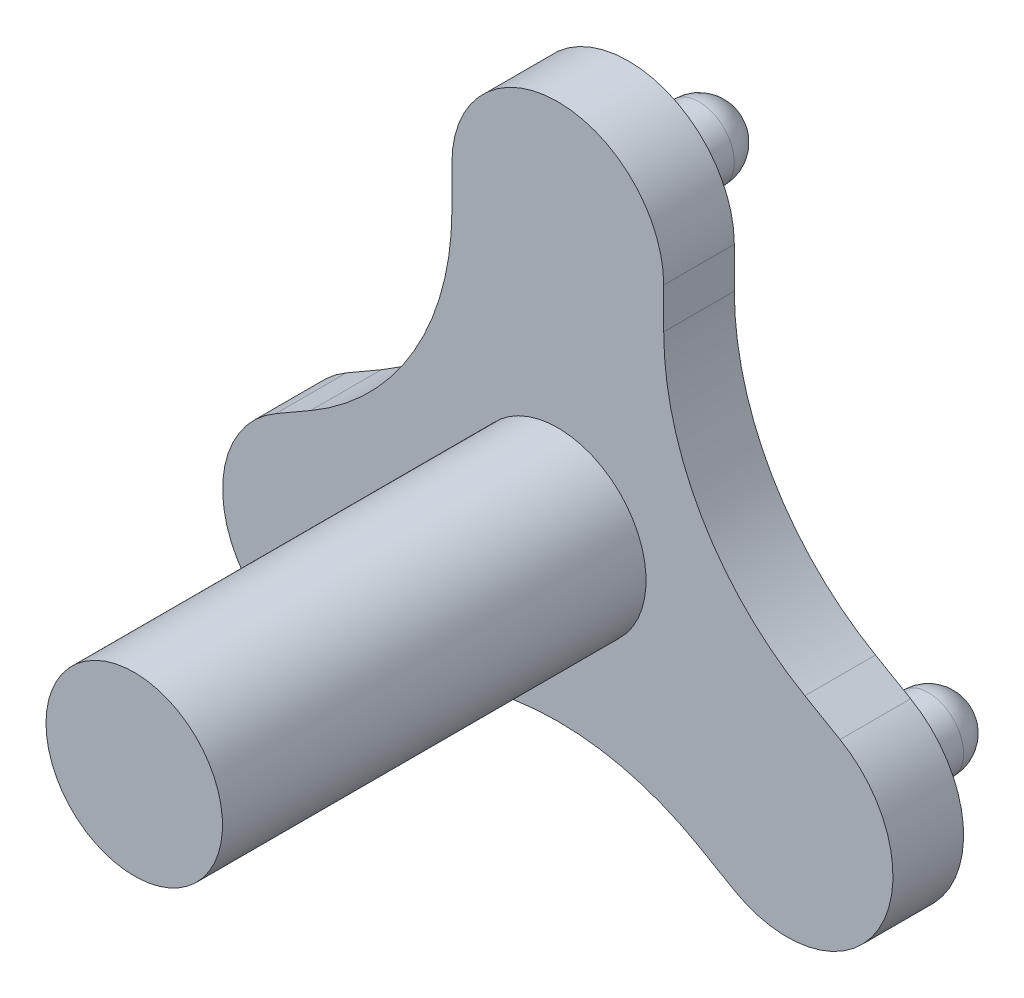
ISO-10303-21;
HEADER;
FILE_DESCRIPTION(('STEP AP214'),'2;1');
FILE_NAME('part.step','',(''),(''),'','','');
FILE_SCHEMA(('AUTOMOTIVE_DESIGN { 1 0 10303 214 1 1 1 1 }'));
ENDSEC;
DATA;
#1=APPLICATION_CONTEXT('core data for automotive mechanical design processes');
#2=APPLICATION_PROTOCOL_DEFINITION('international standard','automotive_design',2000,#1);
#3=PRODUCT_CONTEXT('',#1,'mechanical');
#4=PRODUCT('Part','Part','',(#3));
#5=PRODUCT_RELATED_PRODUCT_CATEGORY('part','',(#4));
#6=PRODUCT_DEFINITION_FORMATION('','',#4);
#7=PRODUCT_DEFINITION_CONTEXT('part definition',#1,'design');
#8=PRODUCT_DEFINITION('design','',#6,#7);
#9=PRODUCT_DEFINITION_SHAPE('','',#8);
#10=(LENGTH_UNIT() NAMED_UNIT(*) SI_UNIT(.MILLI.,.METRE.));
#11=(NAMED_UNIT(*) PLANE_ANGLE_UNIT() SI_UNIT($,.RADIAN.));
#12=(NAMED_UNIT(*) SI_UNIT($,.STERADIAN.) SOLID_ANGLE_UNIT());
#13=UNCERTAINTY_MEASURE_WITH_UNIT(LENGTH_MEASURE(1.E-05),#10,'distance_accuracy_value','');
#14=(GEOMETRIC_REPRESENTATION_CONTEXT(3) GLOBAL_UNCERTAINTY_ASSIGNED_CONTEXT((#13)) GLOBAL_UNIT_ASSIGNED_CONTEXT((#10,
#11,#12)) REPRESENTATION_CONTEXT('',''));
#15=CARTESIAN_POINT('',(0.,0.,0.));
#16=DIRECTION('',(0.,0.,1.));
#17=DIRECTION('',(1.,0.,0.));
#18=AXIS2_PLACEMENT_3D('',#15,#16,#17);
#19=CARTESIAN_POINT('',(4.7625,-8.24889197104678,6.35));
#20=DIRECTION('',(0.5,-0.866025403784439,0.));
#21=DIRECTION('',(0.866025403784439,0.5,0.));
#22=AXIS2_PLACEMENT_3D('',#19,#20,#21);
#23=PLANE('',#22);
#24=DIRECTION('',(-0.866025403784439,-0.5,0.));
#25=VECTOR('',#24,1.);
#26=CARTESIAN_POINT('',(4.7625,-8.24889197104678,0.));
#27=LINE('',#26,#25);
#28=CARTESIAN_POINT('',(-12.7,-18.3308710467706,0.));
#29=VERTEX_POINT('',#28);
#30=CARTESIAN_POINT('',(-15.859729927617,-20.1551419710468,0.));
#31=VERTEX_POINT('',#30);
#32=EDGE_CURVE('E214',#29,#31,#27,.T.);
#33=ORIENTED_EDGE('',*,*,#32,.F.);
#34=DIRECTION('',(0.,0.,-1.));
#35=VECTOR('',#34,1.);
#36=CARTESIAN_POINT('',(-12.7,-18.3308710467706,6.35));
#37=LINE('',#36,#35);
#38=CARTESIAN_POINT('',(-12.7,-18.3308710467706,6.35));
#39=VERTEX_POINT('',#38);
#40=EDGE_CURVE('E269',#29,#39,#37,.F.);
#41=ORIENTED_EDGE('',*,*,#40,.T.);
#42=DIRECTION('',(-0.866025403784439,-0.5,0.));
#43=VECTOR('',#42,1.);
#44=CARTESIAN_POINT('',(4.7625,-8.24889197104678,6.35));
#45=LINE('',#44,#43);
#46=CARTESIAN_POINT('',(-15.859729927617,-20.1551419710468,6.35));
#47=VERTEX_POINT('',#46);
#48=EDGE_CURVE('E173',#39,#47,#45,.T.);
#49=ORIENTED_EDGE('',*,*,#48,.T.);
#50=DIRECTION('',(0.,0.,-1.));
#51=VECTOR('',#50,1.);
#52=CARTESIAN_POINT('',(-15.859729927617,-20.1551419710468,6.35));
#53=LINE('',#52,#51);
#54=EDGE_CURVE('E213',#47,#31,#53,.T.);
#55=ORIENTED_EDGE('',*,*,#54,.T.);
#56=EDGE_LOOP('',(#33,#41,#49,#55));
#57=FACE_BOUND('',#56,.T.);
#58=ADVANCED_FACE('F45',(#57),#23,.T.);
#59=CARTESIAN_POINT('',(-4.7625,-8.24889197104678,6.35));
#60=DIRECTION('',(0.5,0.866025403784439,0.));
#61=DIRECTION('',(-0.866025403784439,0.5,0.));
#62=AXIS2_PLACEMENT_3D('',#59,#60,#61);
#63=PLANE('',#62);
#64=DIRECTION('',(0.866025403784439,-0.5,0.));
#65=VECTOR('',#64,1.);
#66=CARTESIAN_POINT('',(-4.7625,-8.24889197104678,6.35));
#67=LINE('',#66,#65);
#68=CARTESIAN_POINT('',(12.7,-18.3308710467706,6.35));
#69=VERTEX_POINT('',#68);
#70=CARTESIAN_POINT('',(15.859729927617,-20.1551419710468,6.35));
#71=VERTEX_POINT('',#70);
#72=EDGE_CURVE('E159',#69,#71,#67,.T.);
#73=ORIENTED_EDGE('',*,*,#72,.F.);
#74=DIRECTION('',(0.,0.,-1.));
#75=VECTOR('',#74,1.);
#76=CARTESIAN_POINT('',(12.7,-18.3308710467706,6.35));
#77=LINE('',#76,#75);
#78=CARTESIAN_POINT('',(12.7,-18.3308710467706,0.));
#79=VERTEX_POINT('',#78);
#80=EDGE_CURVE('E266',#69,#79,#77,.T.);
#81=ORIENTED_EDGE('',*,*,#80,.T.);
#82=DIRECTION('',(0.866025403784439,-0.5,0.));
#83=VECTOR('',#82,1.);
#84=CARTESIAN_POINT('',(-4.7625,-8.24889197104678,0.));
#85=LINE('',#84,#83);
#86=CARTESIAN_POINT('',(15.859729927617,-20.1551419710468,0.));
#87=VERTEX_POINT('',#86);
#88=EDGE_CURVE('E179',#79,#87,#85,.T.);
#89=ORIENTED_EDGE('',*,*,#88,.T.);
#90=DIRECTION('',(0.,0.,-1.));
#91=VECTOR('',#90,1.);
#92=CARTESIAN_POINT('',(15.859729927617,-20.1551419710468,6.35));
#93=LINE('',#92,#91);
#94=EDGE_CURVE('E176',#71,#87,#93,.T.);
#95=ORIENTED_EDGE('',*,*,#94,.F.);
#96=EDGE_LOOP('',(#73,#81,#89,#95));
#97=FACE_BOUND('',#96,.T.);
#98=ADVANCED_FACE('F177',(#97),#63,.F.);
#99=CARTESIAN_POINT('',(20.6222299276169,-11.9062500000001,6.35));
#100=DIRECTION('',(0.,0.,-1.));
#101=DIRECTION('',(-1.,0.,0.));
#102=AXIS2_PLACEMENT_3D('',#99,#100,#101);
#103=CYLINDRICAL_SURFACE('',#102,9.525);
#104=CARTESIAN_POINT('',(20.6222299276169,-11.9062500000001,0.));
#105=DIRECTION('',(0.,0.,1.));
#106=DIRECTION('',(1.,0.,0.));
#107=AXIS2_PLACEMENT_3D('',#104,#105,#106);
#108=CIRCLE('',#107,9.525);
#109=CARTESIAN_POINT('',(25.384729927617,-3.65735802895323,0.));
#110=VERTEX_POINT('',#109);
#111=EDGE_CURVE('E220',#87,#110,#108,.T.);
#112=ORIENTED_EDGE('',*,*,#111,.T.);
#113=DIRECTION('',(0.,0.,-1.));
#114=VECTOR('',#113,1.);
#115=CARTESIAN_POINT('',(25.384729927617,-3.65735802895323,6.35));
#116=LINE('',#115,#114);
#117=CARTESIAN_POINT('',(25.384729927617,-3.65735802895323,6.35));
#118=VERTEX_POINT('',#117);
#119=EDGE_CURVE('E185',#118,#110,#116,.T.);
#120=ORIENTED_EDGE('',*,*,#119,.F.);
#121=CARTESIAN_POINT('',(20.6222299276169,-11.9062500000001,6.35));
#122=DIRECTION('',(0.,0.,1.));
#123=DIRECTION('',(1.,0.,0.));
#124=AXIS2_PLACEMENT_3D('',#121,#122,#123);
#125=CIRCLE('',#124,9.525);
#126=EDGE_CURVE('E165',#71,#118,#125,.T.);
#127=ORIENTED_EDGE('',*,*,#126,.F.);
#128=ORIENTED_EDGE('',*,*,#94,.T.);
#129=EDGE_LOOP('',(#112,#120,#127,#128));
#130=FACE_BOUND('',#129,.T.);
#131=ADVANCED_FACE('F187',(#130),#103,.T.);
#132=CARTESIAN_POINT('',(4.7625,8.24889197104678,6.35));
#133=DIRECTION('',(0.5,0.866025403784438,0.));
#134=DIRECTION('',(-0.866025403784439,0.5,0.));
#135=AXIS2_PLACEMENT_3D('',#132,#133,#134);
#136=PLANE('',#135);
#137=DIRECTION('',(0.866025403784439,-0.5,0.));
#138=VECTOR('',#137,1.);
#139=CARTESIAN_POINT('',(4.7625,8.24889197104678,0.));
#140=LINE('',#139,#138);
#141=CARTESIAN_POINT('',(22.225,-1.83308710467707,0.));
#142=VERTEX_POINT('',#141);
#143=EDGE_CURVE('E223',#142,#110,#140,.T.);
#144=ORIENTED_EDGE('',*,*,#143,.F.);
#145=DIRECTION('',(0.,0.,-1.));
#146=VECTOR('',#145,1.);
#147=CARTESIAN_POINT('',(22.225,-1.83308710467706,6.35));
#148=LINE('',#147,#146);
#149=CARTESIAN_POINT('',(22.225,-1.83308710467707,6.35));
#150=VERTEX_POINT('',#149);
#151=EDGE_CURVE('E263',#142,#150,#148,.F.);
#152=ORIENTED_EDGE('',*,*,#151,.T.);
#153=DIRECTION('',(0.866025403784439,-0.5,0.));
#154=VECTOR('',#153,1.);
#155=CARTESIAN_POINT('',(4.7625,8.24889197104678,6.35));
#156=LINE('',#155,#154);
#157=EDGE_CURVE('E190',#150,#118,#156,.T.);
#158=ORIENTED_EDGE('',*,*,#157,.T.);
#159=ORIENTED_EDGE('',*,*,#119,.T.);
#160=EDGE_LOOP('',(#144,#152,#158,#159));
#161=FACE_BOUND('',#160,.T.);
#162=ADVANCED_FACE('F372',(#161),#136,.T.);
#163=CARTESIAN_POINT('',(9.525,0.,6.35));
#164=DIRECTION('',(-1.,0.,0.));
#165=DIRECTION('',(0.,0.,1.));
#166=AXIS2_PLACEMENT_3D('',#163,#164,#165);
#167=PLANE('',#166);
#168=DIRECTION('',(0.,1.,0.));
#169=VECTOR('',#168,1.);
#170=CARTESIAN_POINT('',(9.525,0.,6.35));
#171=LINE('',#170,#169);
#172=CARTESIAN_POINT('',(9.525,20.1639581514477,6.35));
#173=VERTEX_POINT('',#172);
#174=CARTESIAN_POINT('',(9.525,23.8125,6.35));
#175=VERTEX_POINT('',#174);
#176=EDGE_CURVE('E193',#173,#175,#171,.T.);
#177=ORIENTED_EDGE('',*,*,#176,.F.);
#178=DIRECTION('',(0.,0.,-1.));
#179=VECTOR('',#178,1.);
#180=CARTESIAN_POINT('',(9.525,20.1639581514477,6.35));
#181=LINE('',#180,#179);
#182=CARTESIAN_POINT('',(9.525,20.1639581514477,0.));
#183=VERTEX_POINT('',#182);
#184=EDGE_CURVE('E184',#173,#183,#181,.T.);
#185=ORIENTED_EDGE('',*,*,#184,.T.);
#186=DIRECTION('',(0.,1.,0.));
#187=VECTOR('',#186,1.);
#188=CARTESIAN_POINT('',(9.525,0.,0.));
#189=LINE('',#188,#187);
#190=CARTESIAN_POINT('',(9.525,23.8125,0.));
#191=VERTEX_POINT('',#190);
#192=EDGE_CURVE('E226',#183,#191,#189,.T.);
#193=ORIENTED_EDGE('',*,*,#192,.T.);
#194=DIRECTION('',(0.,0.,-1.));
#195=VECTOR('',#194,1.);
#196=CARTESIAN_POINT('',(9.525,23.8125,6.35));
#197=LINE('',#196,#195);
#198=EDGE_CURVE('E254',#175,#191,#197,.T.);
#199=ORIENTED_EDGE('',*,*,#198,.F.);
#200=EDGE_LOOP('',(#177,#185,#193,#199));
#201=FACE_BOUND('',#200,.T.);
#202=ADVANCED_FACE('F377',(#201),#167,.F.);
#203=CARTESIAN_POINT('',(0.,23.8125,6.35));
#204=DIRECTION('',(0.,0.,-1.));
#205=DIRECTION('',(-1.,0.,0.));
#206=AXIS2_PLACEMENT_3D('',#203,#204,#205);
#207=CYLINDRICAL_SURFACE('',#206,9.525);
#208=CARTESIAN_POINT('',(0.,23.8125,0.));
#209=DIRECTION('',(0.,0.,1.));
#210=DIRECTION('',(1.,0.,0.));
#211=AXIS2_PLACEMENT_3D('',#208,#209,#210);
#212=CIRCLE('',#211,9.525);
#213=CARTESIAN_POINT('',(-9.525,23.8125,0.));
#214=VERTEX_POINT('',#213);
#215=EDGE_CURVE('E229',#191,#214,#212,.T.);
#216=ORIENTED_EDGE('',*,*,#215,.T.);
#217=DIRECTION('',(0.,0.,-1.));
#218=VECTOR('',#217,1.);
#219=CARTESIAN_POINT('',(-9.525,23.8125,6.35));
#220=LINE('',#219,#218);
#221=CARTESIAN_POINT('',(-9.525,23.8125,6.35));
#222=VERTEX_POINT('',#221);
#223=EDGE_CURVE('E250',#222,#214,#220,.T.);
#224=ORIENTED_EDGE('',*,*,#223,.F.);
#225=CARTESIAN_POINT('',(0.,23.8125,6.35));
#226=DIRECTION('',(0.,0.,1.));
#227=DIRECTION('',(1.,0.,0.));
#228=AXIS2_PLACEMENT_3D('',#225,#226,#227);
#229=CIRCLE('',#228,9.525);
#230=EDGE_CURVE('E199',#175,#222,#229,.T.);
#231=ORIENTED_EDGE('',*,*,#230,.F.);
#232=ORIENTED_EDGE('',*,*,#198,.T.);
#233=EDGE_LOOP('',(#216,#224,#231,#232));
#234=FACE_BOUND('',#233,.T.);
#235=ADVANCED_FACE('F382',(#234),#207,.T.);
#236=CARTESIAN_POINT('',(-9.525,0.,6.35));
#237=DIRECTION('',(-1.,0.,0.));
#238=DIRECTION('',(0.,0.,1.));
#239=AXIS2_PLACEMENT_3D('',#236,#237,#238);
#240=PLANE('',#239);
#241=DIRECTION('',(0.,1.,0.));
#242=VECTOR('',#241,1.);
#243=CARTESIAN_POINT('',(-9.525,0.,0.));
#244=LINE('',#243,#242);
#245=CARTESIAN_POINT('',(-9.525,20.1639581514477,0.));
#246=VERTEX_POINT('',#245);
#247=EDGE_CURVE('E233',#246,#214,#244,.T.);
#248=ORIENTED_EDGE('',*,*,#247,.F.);
#249=DIRECTION('',(0.,0.,-1.));
#250=VECTOR('',#249,1.);
#251=CARTESIAN_POINT('',(-9.525,20.1639581514477,6.35));
#252=LINE('',#251,#250);
#253=CARTESIAN_POINT('',(-9.525,20.1639581514477,6.35));
#254=VERTEX_POINT('',#253);
#255=EDGE_CURVE('E63',#246,#254,#252,.F.);
#256=ORIENTED_EDGE('',*,*,#255,.T.);
#257=DIRECTION('',(0.,1.,0.));
#258=VECTOR('',#257,1.);
#259=CARTESIAN_POINT('',(-9.525,0.,6.35));
#260=LINE('',#259,#258);
#261=EDGE_CURVE('E203',#254,#222,#260,.T.);
#262=ORIENTED_EDGE('',*,*,#261,.T.);
#263=ORIENTED_EDGE('',*,*,#223,.T.);
#264=EDGE_LOOP('',(#248,#256,#262,#263));
#265=FACE_BOUND('',#264,.T.);
#266=ADVANCED_FACE('F384',(#265),#240,.T.);
#267=CARTESIAN_POINT('',(-4.7625,8.24889197104678,6.35));
#268=DIRECTION('',(0.5,-0.866025403784439,0.));
#269=DIRECTION('',(0.866025403784439,0.5,0.));
#270=AXIS2_PLACEMENT_3D('',#267,#268,#269);
#271=PLANE('',#270);
#272=DIRECTION('',(-0.866025403784439,-0.5,0.));
#273=VECTOR('',#272,1.);
#274=CARTESIAN_POINT('',(-4.7625,8.24889197104678,6.35));
#275=LINE('',#274,#273);
#276=CARTESIAN_POINT('',(-22.225,-1.83308710467706,6.35));
#277=VERTEX_POINT('',#276);
#278=CARTESIAN_POINT('',(-25.3847299276169,-3.65735802895323,6.35));
#279=VERTEX_POINT('',#278);
#280=EDGE_CURVE('E206',#277,#279,#275,.T.);
#281=ORIENTED_EDGE('',*,*,#280,.F.);
#282=DIRECTION('',(0.,0.,-1.));
#283=VECTOR('',#282,1.);
#284=CARTESIAN_POINT('',(-22.225,-1.83308710467706,6.35));
#285=LINE('',#284,#283);
#286=CARTESIAN_POINT('',(-22.225,-1.83308710467706,0.));
#287=VERTEX_POINT('',#286);
#288=EDGE_CURVE('E272',#277,#287,#285,.T.);
#289=ORIENTED_EDGE('',*,*,#288,.T.);
#290=DIRECTION('',(-0.866025403784439,-0.5,0.));
#291=VECTOR('',#290,1.);
#292=CARTESIAN_POINT('',(-4.7625,8.24889197104678,0.));
#293=LINE('',#292,#291);
#294=CARTESIAN_POINT('',(-25.3847299276169,-3.65735802895323,0.));
#295=VERTEX_POINT('',#294);
#296=EDGE_CURVE('E236',#287,#295,#293,.T.);
#297=ORIENTED_EDGE('',*,*,#296,.T.);
#298=DIRECTION('',(0.,0.,-1.));
#299=VECTOR('',#298,1.);
#300=CARTESIAN_POINT('',(-25.3847299276169,-3.65735802895323,6.35));
#301=LINE('',#300,#299);
#302=EDGE_CURVE('E246',#279,#295,#301,.T.);
#303=ORIENTED_EDGE('',*,*,#302,.F.);
#304=EDGE_LOOP('',(#281,#289,#297,#303));
#305=FACE_BOUND('',#304,.T.);
#306=ADVANCED_FACE('F360',(#305),#271,.F.);
#307=CARTESIAN_POINT('',(-20.6222299276171,-11.9062499999998,6.35));
#308=DIRECTION('',(0.,0.,-1.));
#309=DIRECTION('',(-1.,0.,0.));
#310=AXIS2_PLACEMENT_3D('',#307,#308,#309);
#311=CYLINDRICAL_SURFACE('',#310,9.525);
#312=CARTESIAN_POINT('',(-20.6222299276171,-11.9062499999998,0.));
#313=DIRECTION('',(0.,0.,1.));
#314=DIRECTION('',(1.,0.,0.));
#315=AXIS2_PLACEMENT_3D('',#312,#313,#314);
#316=CIRCLE('',#315,9.525);
#317=EDGE_CURVE('E239',#295,#31,#316,.T.);
#318=ORIENTED_EDGE('',*,*,#317,.T.);
#319=ORIENTED_EDGE('',*,*,#54,.F.);
#320=CARTESIAN_POINT('',(-20.6222299276171,-11.9062499999998,6.35));
#321=DIRECTION('',(0.,0.,1.));
#322=DIRECTION('',(1.,0.,0.));
#323=AXIS2_PLACEMENT_3D('',#320,#321,#322);
#324=CIRCLE('',#323,9.525);
#325=EDGE_CURVE('E209',#279,#47,#324,.T.);
#326=ORIENTED_EDGE('',*,*,#325,.F.);
#327=ORIENTED_EDGE('',*,*,#302,.T.);
#328=EDGE_LOOP('',(#318,#319,#326,#327));
#329=FACE_BOUND('',#328,.T.);
#330=ADVANCED_FACE('F365',(#329),#311,.T.);
#331=CARTESIAN_POINT('',(0.,0.,6.35));
#332=DIRECTION('',(0.,0.,1.));
#333=DIRECTION('',(1.,0.,0.));
#334=AXIS2_PLACEMENT_3D('',#331,#332,#333);
#335=PLANE('',#334);
#336=CARTESIAN_POINT('',(0.,0.,6.35));
#337=DIRECTION('',(0.,0.,1.));
#338=DIRECTION('',(1.,0.,0.));
#339=AXIS2_PLACEMENT_3D('',#336,#337,#338);
#340=CIRCLE('',#339,7.9375);
#341=CARTESIAN_POINT('',(-7.9375,0.,6.35));
#342=VERTEX_POINT('',#341);
#343=EDGE_CURVE('E554',#342,#342,#340,.T.);
#344=ORIENTED_EDGE('',*,*,#343,.F.);
#345=EDGE_LOOP('',(#344));
#346=FACE_BOUND('',#345,.T.);
#347=ORIENTED_EDGE('',*,*,#48,.F.);
#348=CARTESIAN_POINT('',(0.,-40.3279163028954,6.35));
#349=DIRECTION('',(0.,0.,1.));
#350=DIRECTION('',(1.,0.,0.));
#351=AXIS2_PLACEMENT_3D('',#348,#349,#350);
#352=CIRCLE('',#351,25.4);
#353=EDGE_CURVE('E168',#39,#69,#352,.F.);
#354=ORIENTED_EDGE('',*,*,#353,.T.);
#355=ORIENTED_EDGE('',*,*,#72,.T.);
#356=ORIENTED_EDGE('',*,*,#126,.T.);
#357=ORIENTED_EDGE('',*,*,#157,.F.);
#358=CARTESIAN_POINT('',(34.925,20.1639581514477,6.35));
#359=DIRECTION('',(0.,0.,1.));
#360=DIRECTION('',(1.,0.,0.));
#361=AXIS2_PLACEMENT_3D('',#358,#359,#360);
#362=CIRCLE('',#361,25.4);
#363=EDGE_CURVE('E281',#150,#173,#362,.F.);
#364=ORIENTED_EDGE('',*,*,#363,.T.);
#365=ORIENTED_EDGE('',*,*,#176,.T.);
#366=ORIENTED_EDGE('',*,*,#230,.T.);
#367=ORIENTED_EDGE('',*,*,#261,.F.);
#368=CARTESIAN_POINT('',(-34.925,20.1639581514477,6.35));
#369=DIRECTION('',(0.,0.,1.));
#370=DIRECTION('',(1.,0.,0.));
#371=AXIS2_PLACEMENT_3D('',#368,#369,#370);
#372=CIRCLE('',#371,25.4);
#373=EDGE_CURVE('E291',#254,#277,#372,.F.);
#374=ORIENTED_EDGE('',*,*,#373,.T.);
#375=ORIENTED_EDGE('',*,*,#280,.T.);
#376=ORIENTED_EDGE('',*,*,#325,.T.);
#377=EDGE_LOOP('',(#347,#354,#355,#356,#357,#364,#365,#366,#367,#374,#375,#376));
#378=FACE_BOUND('',#377,.T.);
#379=ADVANCED_FACE('F162',(#346,#378),#335,.T.);
#380=CARTESIAN_POINT('',(0.,0.,0.));
#381=DIRECTION('',(0.,0.,1.));
#382=DIRECTION('',(1.,0.,0.));
#383=AXIS2_PLACEMENT_3D('',#380,#381,#382);
#384=PLANE('',#383);
#385=CARTESIAN_POINT('',(20.6222299276169,-11.90625,0.));
#386=DIRECTION('',(0.,0.,1.));
#387=DIRECTION('',(1.,0.,0.));
#388=AXIS2_PLACEMENT_3D('',#385,#386,#387);
#389=CIRCLE('',#388,3.17500000000119);
#390=CARTESIAN_POINT('',(23.7972299276181,-11.90625,0.));
#391=VERTEX_POINT('',#390);
#392=EDGE_CURVE('E302',#391,#391,#389,.F.);
#393=ORIENTED_EDGE('',*,*,#392,.F.);
#394=EDGE_LOOP('',(#393));
#395=FACE_BOUND('',#394,.T.);
#396=CARTESIAN_POINT('',(-20.6222299276169,-11.90625,0.));
#397=DIRECTION('',(0.,0.,1.));
#398=DIRECTION('',(1.,0.,0.));
#399=AXIS2_PLACEMENT_3D('',#396,#397,#398);
#400=CIRCLE('',#399,3.1750000000017);
#401=CARTESIAN_POINT('',(-17.4472299276152,-11.90625,0.));
#402=VERTEX_POINT('',#401);
#403=EDGE_CURVE('E298',#402,#402,#400,.F.);
#404=ORIENTED_EDGE('',*,*,#403,.F.);
#405=EDGE_LOOP('',(#404));
#406=FACE_BOUND('',#405,.T.);
#407=CARTESIAN_POINT('',(0.,23.8125,0.));
#408=DIRECTION('',(0.,0.,1.));
#409=DIRECTION('',(1.,0.,0.));
#410=AXIS2_PLACEMENT_3D('',#407,#408,#409);
#411=CIRCLE('',#410,3.175);
#412=CARTESIAN_POINT('',(3.175,23.8125,0.));
#413=VERTEX_POINT('',#412);
#414=EDGE_CURVE('E294',#413,#413,#411,.F.);
#415=ORIENTED_EDGE('',*,*,#414,.F.);
#416=EDGE_LOOP('',(#415));
#417=FACE_BOUND('',#416,.T.);
#418=ORIENTED_EDGE('',*,*,#88,.F.);
#419=CARTESIAN_POINT('',(0.,-40.3279163028954,0.));
#420=DIRECTION('',(0.,0.,1.));
#421=DIRECTION('',(1.,0.,0.));
#422=AXIS2_PLACEMENT_3D('',#419,#420,#421);
#423=CIRCLE('',#422,25.4);
#424=EDGE_CURVE('E284',#79,#29,#423,.T.);
#425=ORIENTED_EDGE('',*,*,#424,.T.);
#426=ORIENTED_EDGE('',*,*,#32,.T.);
#427=ORIENTED_EDGE('',*,*,#317,.F.);
#428=ORIENTED_EDGE('',*,*,#296,.F.);
#429=CARTESIAN_POINT('',(-34.925,20.1639581514477,0.));
#430=DIRECTION('',(0.,0.,1.));
#431=DIRECTION('',(1.,0.,0.));
#432=AXIS2_PLACEMENT_3D('',#429,#430,#431);
#433=CIRCLE('',#432,25.4);
#434=EDGE_CURVE('E73',#287,#246,#433,.T.);
#435=ORIENTED_EDGE('',*,*,#434,.T.);
#436=ORIENTED_EDGE('',*,*,#247,.T.);
#437=ORIENTED_EDGE('',*,*,#215,.F.);
#438=ORIENTED_EDGE('',*,*,#192,.F.);
#439=CARTESIAN_POINT('',(34.925,20.1639581514477,0.));
#440=DIRECTION('',(0.,0.,1.));
#441=DIRECTION('',(1.,0.,0.));
#442=AXIS2_PLACEMENT_3D('',#439,#440,#441);
#443=CIRCLE('',#442,25.4);
#444=EDGE_CURVE('E278',#183,#142,#443,.T.);
#445=ORIENTED_EDGE('',*,*,#444,.T.);
#446=ORIENTED_EDGE('',*,*,#143,.T.);
#447=ORIENTED_EDGE('',*,*,#111,.F.);
#448=EDGE_LOOP('',(#418,#425,#426,#427,#428,#435,#436,#437,#438,#445,#446,#447));
#449=FACE_BOUND('',#448,.T.);
#450=ADVANCED_FACE('F342',(#395,#406,#417,#449),#384,.F.);
#451=CARTESIAN_POINT('',(34.925,20.1639581514477,6.35));
#452=DIRECTION('',(0.,0.,-1.));
#453=DIRECTION('',(-1.,0.,0.));
#454=AXIS2_PLACEMENT_3D('',#451,#452,#453);
#455=CYLINDRICAL_SURFACE('',#454,25.4);
#456=ORIENTED_EDGE('',*,*,#363,.F.);
#457=ORIENTED_EDGE('',*,*,#151,.F.);
#458=ORIENTED_EDGE('',*,*,#444,.F.);
#459=ORIENTED_EDGE('',*,*,#184,.F.);
#460=EDGE_LOOP('',(#456,#457,#458,#459));
#461=FACE_BOUND('',#460,.T.);
#462=ADVANCED_FACE('F338',(#461),#455,.F.);
#463=CARTESIAN_POINT('',(0.,-40.3279163028954,6.35));
#464=DIRECTION('',(0.,0.,-1.));
#465=DIRECTION('',(-1.,0.,0.));
#466=AXIS2_PLACEMENT_3D('',#463,#464,#465);
#467=CYLINDRICAL_SURFACE('',#466,25.4);
#468=ORIENTED_EDGE('',*,*,#353,.F.);
#469=ORIENTED_EDGE('',*,*,#40,.F.);
#470=ORIENTED_EDGE('',*,*,#424,.F.);
#471=ORIENTED_EDGE('',*,*,#80,.F.);
#472=EDGE_LOOP('',(#468,#469,#470,#471));
#473=FACE_BOUND('',#472,.T.);
#474=ADVANCED_FACE('F341',(#473),#467,.F.);
#475=CARTESIAN_POINT('',(-34.925,20.1639581514477,6.35));
#476=DIRECTION('',(0.,0.,-1.));
#477=DIRECTION('',(-1.,0.,0.));
#478=AXIS2_PLACEMENT_3D('',#475,#476,#477);
#479=CYLINDRICAL_SURFACE('',#478,25.4);
#480=ORIENTED_EDGE('',*,*,#373,.F.);
#481=ORIENTED_EDGE('',*,*,#255,.F.);
#482=ORIENTED_EDGE('',*,*,#434,.F.);
#483=ORIENTED_EDGE('',*,*,#288,.F.);
#484=EDGE_LOOP('',(#480,#481,#482,#483));
#485=FACE_BOUND('',#484,.T.);
#486=ADVANCED_FACE('F346',(#485),#479,.F.);
#487=CARTESIAN_POINT('',(0.,23.8125,-9.525));
#488=DIRECTION('',(0.,0.,1.));
#489=DIRECTION('',(1.,0.,0.));
#490=AXIS2_PLACEMENT_3D('',#487,#488,#489);
#491=CYLINDRICAL_SURFACE('',#490,3.175);
#492=CARTESIAN_POINT('',(0.,23.8125,-6.35));
#493=DIRECTION('',(0.,0.,1.));
#494=DIRECTION('',(1.,0.,0.));
#495=AXIS2_PLACEMENT_3D('',#492,#493,#494);
#496=CIRCLE('',#495,3.175);
#497=CARTESIAN_POINT('',(3.175,23.8125,-6.35));
#498=VERTEX_POINT('',#497);
#499=EDGE_CURVE('E54',#498,#498,#496,.T.);
#500=CARTESIAN_POINT('',(3.175,23.8125,-6.35));
#501=CARTESIAN_POINT('',(3.175,23.8125,-6.28385416666667));
#502=CARTESIAN_POINT('',(3.175,23.8125,-6.21770833333333));
#503=CARTESIAN_POINT('',(3.175,23.8125,-6.08541666666667));
#504=CARTESIAN_POINT('',(3.175,23.8125,-6.01927083333333));
#505=CARTESIAN_POINT('',(3.175,23.8125,-5.88697916666667));
#506=CARTESIAN_POINT('',(3.175,23.8125,-5.82083333333333));
#507=CARTESIAN_POINT('',(3.175,23.8125,-5.68854166666667));
#508=CARTESIAN_POINT('',(3.175,23.8125,-5.62239583333333));
#509=CARTESIAN_POINT('',(3.175,23.8125,-5.49010416666667));
#510=CARTESIAN_POINT('',(3.175,23.8125,-5.42395833333333));
#511=CARTESIAN_POINT('',(3.175,23.8125,-5.29166666666667));
#512=CARTESIAN_POINT('',(3.175,23.8125,-5.22552083333333));
#513=CARTESIAN_POINT('',(3.175,23.8125,-5.09322916666667));
#514=CARTESIAN_POINT('',(3.175,23.8125,-5.02708333333333));
#515=CARTESIAN_POINT('',(3.175,23.8125,-4.89479166666667));
#516=CARTESIAN_POINT('',(3.175,23.8125,-4.82864583333333));
#517=CARTESIAN_POINT('',(3.175,23.8125,-4.69635416666667));
#518=CARTESIAN_POINT('',(3.175,23.8125,-4.63020833333333));
#519=CARTESIAN_POINT('',(3.175,23.8125,-4.49791666666667));
#520=CARTESIAN_POINT('',(3.175,23.8125,-4.43177083333333));
#521=CARTESIAN_POINT('',(3.175,23.8125,-4.29947916666667));
#522=CARTESIAN_POINT('',(3.175,23.8125,-4.23333333333333));
#523=CARTESIAN_POINT('',(3.175,23.8125,-4.10104166666667));
#524=CARTESIAN_POINT('',(3.175,23.8125,-4.03489583333333));
#525=CARTESIAN_POINT('',(3.175,23.8125,-3.90260416666667));
#526=CARTESIAN_POINT('',(3.175,23.8125,-3.83645833333333));
#527=CARTESIAN_POINT('',(3.175,23.8125,-3.70416666666667));
#528=CARTESIAN_POINT('',(3.175,23.8125,-3.63802083333333));
#529=CARTESIAN_POINT('',(3.175,23.8125,-3.50572916666667));
#530=CARTESIAN_POINT('',(3.175,23.8125,-3.43958333333333));
#531=CARTESIAN_POINT('',(3.175,23.8125,-3.30729166666667));
#532=CARTESIAN_POINT('',(3.175,23.8125,-3.24114583333333));
#533=CARTESIAN_POINT('',(3.175,23.8125,-3.10885416666667));
#534=CARTESIAN_POINT('',(3.175,23.8125,-3.04270833333333));
#535=CARTESIAN_POINT('',(3.175,23.8125,-2.91041666666667));
#536=CARTESIAN_POINT('',(3.175,23.8125,-2.84427083333333));
#537=CARTESIAN_POINT('',(3.175,23.8125,-2.71197916666667));
#538=CARTESIAN_POINT('',(3.175,23.8125,-2.64583333333333));
#539=CARTESIAN_POINT('',(3.175,23.8125,-2.51354166666667));
#540=CARTESIAN_POINT('',(3.175,23.8125,-2.44739583333333));
#541=CARTESIAN_POINT('',(3.175,23.8125,-2.31510416666667));
#542=CARTESIAN_POINT('',(3.175,23.8125,-2.24895833333333));
#543=CARTESIAN_POINT('',(3.175,23.8125,-2.11666666666667));
#544=CARTESIAN_POINT('',(3.175,23.8125,-2.05052083333333));
#545=CARTESIAN_POINT('',(3.175,23.8125,-1.91822916666667));
#546=CARTESIAN_POINT('',(3.175,23.8125,-1.85208333333333));
#547=CARTESIAN_POINT('',(3.175,23.8125,-1.71979166666667));
#548=CARTESIAN_POINT('',(3.175,23.8125,-1.65364583333333));
#549=CARTESIAN_POINT('',(3.175,23.8125,-1.52135416666667));
#550=CARTESIAN_POINT('',(3.175,23.8125,-1.45520833333333));
#551=CARTESIAN_POINT('',(3.175,23.8125,-1.32291666666667));
#552=CARTESIAN_POINT('',(3.175,23.8125,-1.25677083333333));
#553=CARTESIAN_POINT('',(3.175,23.8125,-1.12447916666667));
#554=CARTESIAN_POINT('',(3.175,23.8125,-1.05833333333333));
#555=CARTESIAN_POINT('',(3.175,23.8125,-0.926041666666666));
#556=CARTESIAN_POINT('',(3.175,23.8125,-0.859895833333333));
#557=CARTESIAN_POINT('',(3.175,23.8125,-0.727604166666666));
#558=CARTESIAN_POINT('',(3.175,23.8125,-0.661458333333333));
#559=CARTESIAN_POINT('',(3.175,23.8125,-0.529166666666667));
#560=CARTESIAN_POINT('',(3.175,23.8125,-0.463020833333334));
#561=CARTESIAN_POINT('',(3.175,23.8125,-0.330729166666667));
#562=CARTESIAN_POINT('',(3.175,23.8125,-0.264583333333333));
#563=CARTESIAN_POINT('',(3.175,23.8125,-0.132291666666666));
#564=CARTESIAN_POINT('',(3.175,23.8125,-0.0661458333333329));
#565=CARTESIAN_POINT('',(3.175,23.8125,0.));
#566=B_SPLINE_CURVE_WITH_KNOTS('',3,(#500,#501,#502,#503,#504,#505,#506,#507,#508,#509,#510,
#511,#512,#513,#514,#515,#516,#517,#518,#519,#520,#521,#522,#523,#524,#525,#526,#527,#528,#529,
#530,#531,#532,#533,#534,#535,#536,#537,#538,#539,#540,#541,#542,#543,#544,#545,#546,#547,#548,
#549,#550,#551,#552,#553,#554,#555,#556,#557,#558,#559,#560,#561,#562,#563,#564,#565),
.UNSPECIFIED.,.F.,.F.,(4,2,2,2,2,2,2,2,2,2,2,2,2,2,2,2,2,2,2,2,2,2,2,2,2,2,2,2,2,2,2,2,4),(0.,
0.198437500000001,0.396875000000001,0.5953125,0.79375,0.992187500000001,1.190625,1.3890625,
1.5875,1.7859375,1.984375,2.1828125,2.38125,2.5796875,2.778125,2.9765625,3.175,3.3734375,
3.571875,3.7703125,3.96875,4.1671875,4.365625,4.5640625,4.7625,4.9609375,5.159375,5.3578125,
5.55625,5.7546875,5.953125,6.1515625,6.35),.UNSPECIFIED.);
#567=EDGE_CURVE('BSEAM313',#498,#413,#566,.T.);
#568=ORIENTED_EDGE('',*,*,#499,.T.);
#569=ORIENTED_EDGE('',*,*,#414,.T.);
#570=ORIENTED_EDGE('',*,*,#567,.T.);
#571=ORIENTED_EDGE('',*,*,#567,.F.);
#572=EDGE_LOOP('',(#568,#570,#569,#571));
#573=FACE_BOUND('',#572,.T.);
#574=ADVANCED_FACE('F313',(#573),#491,.T.);
#575=CARTESIAN_POINT('',(-20.6222299276169,-11.90625,-9.525));
#576=DIRECTION('',(0.,0.,1.));
#577=DIRECTION('',(1.,0.,0.));
#578=AXIS2_PLACEMENT_3D('',#575,#576,#577);
#579=CYLINDRICAL_SURFACE('',#578,3.1750000000017);
#580=CARTESIAN_POINT('',(-20.6222299276169,-11.90625,-6.35));
#581=DIRECTION('',(0.,0.,1.));
#582=DIRECTION('',(1.,0.,0.));
#583=AXIS2_PLACEMENT_3D('',#580,#581,#582);
#584=CIRCLE('',#583,3.1750000000017);
#585=CARTESIAN_POINT('',(-17.4472299276152,-11.90625,-6.35));
#586=VERTEX_POINT('',#585);
#587=EDGE_CURVE('E306',#586,#586,#584,.T.);
#588=CARTESIAN_POINT('',(-17.4472299276152,-11.90625,-6.35));
#589=CARTESIAN_POINT('',(-17.4472299276152,-11.90625,-6.28385416666667));
#590=CARTESIAN_POINT('',(-17.4472299276152,-11.90625,-6.21770833333333));
#591=CARTESIAN_POINT('',(-17.4472299276152,-11.90625,-6.08541666666667));
#592=CARTESIAN_POINT('',(-17.4472299276152,-11.90625,-6.01927083333333));
#593=CARTESIAN_POINT('',(-17.4472299276152,-11.90625,-5.88697916666667));
#594=CARTESIAN_POINT('',(-17.4472299276152,-11.90625,-5.82083333333333));
#595=CARTESIAN_POINT('',(-17.4472299276152,-11.90625,-5.68854166666667));
#596=CARTESIAN_POINT('',(-17.4472299276152,-11.90625,-5.62239583333333));
#597=CARTESIAN_POINT('',(-17.4472299276152,-11.90625,-5.49010416666667));
#598=CARTESIAN_POINT('',(-17.4472299276152,-11.90625,-5.42395833333333));
#599=CARTESIAN_POINT('',(-17.4472299276152,-11.90625,-5.29166666666667));
#600=CARTESIAN_POINT('',(-17.4472299276152,-11.90625,-5.22552083333333));
#601=CARTESIAN_POINT('',(-17.4472299276152,-11.90625,-5.09322916666667));
#602=CARTESIAN_POINT('',(-17.4472299276152,-11.90625,-5.02708333333333));
#603=CARTESIAN_POINT('',(-17.4472299276152,-11.90625,-4.89479166666667));
#604=CARTESIAN_POINT('',(-17.4472299276152,-11.90625,-4.82864583333333));
#605=CARTESIAN_POINT('',(-17.4472299276152,-11.90625,-4.69635416666667));
#606=CARTESIAN_POINT('',(-17.4472299276152,-11.90625,-4.63020833333333));
#607=CARTESIAN_POINT('',(-17.4472299276152,-11.90625,-4.49791666666667));
#608=CARTESIAN_POINT('',(-17.4472299276152,-11.90625,-4.43177083333333));
#609=CARTESIAN_POINT('',(-17.4472299276152,-11.90625,-4.29947916666667));
#610=CARTESIAN_POINT('',(-17.4472299276152,-11.90625,-4.23333333333333));
#611=CARTESIAN_POINT('',(-17.4472299276152,-11.90625,-4.10104166666667));
#612=CARTESIAN_POINT('',(-17.4472299276152,-11.90625,-4.03489583333333));
#613=CARTESIAN_POINT('',(-17.4472299276152,-11.90625,-3.90260416666667));
#614=CARTESIAN_POINT('',(-17.4472299276152,-11.90625,-3.83645833333333));
#615=CARTESIAN_POINT('',(-17.4472299276152,-11.90625,-3.70416666666667));
#616=CARTESIAN_POINT('',(-17.4472299276152,-11.90625,-3.63802083333333));
#617=CARTESIAN_POINT('',(-17.4472299276152,-11.90625,-3.50572916666667));
#618=CARTESIAN_POINT('',(-17.4472299276152,-11.90625,-3.43958333333333));
#619=CARTESIAN_POINT('',(-17.4472299276152,-11.90625,-3.30729166666667));
#620=CARTESIAN_POINT('',(-17.4472299276152,-11.90625,-3.24114583333333));
#621=CARTESIAN_POINT('',(-17.4472299276152,-11.90625,-3.10885416666667));
#622=CARTESIAN_POINT('',(-17.4472299276152,-11.90625,-3.04270833333333));
#623=CARTESIAN_POINT('',(-17.4472299276152,-11.90625,-2.91041666666667));
#624=CARTESIAN_POINT('',(-17.4472299276152,-11.90625,-2.84427083333333));
#625=CARTESIAN_POINT('',(-17.4472299276152,-11.90625,-2.71197916666667));
#626=CARTESIAN_POINT('',(-17.4472299276152,-11.90625,-2.64583333333333));
#627=CARTESIAN_POINT('',(-17.4472299276152,-11.90625,-2.51354166666667));
#628=CARTESIAN_POINT('',(-17.4472299276152,-11.90625,-2.44739583333333));
#629=CARTESIAN_POINT('',(-17.4472299276152,-11.90625,-2.31510416666667));
#630=CARTESIAN_POINT('',(-17.4472299276152,-11.90625,-2.24895833333333));
#631=CARTESIAN_POINT('',(-17.4472299276152,-11.90625,-2.11666666666667));
#632=CARTESIAN_POINT('',(-17.4472299276152,-11.90625,-2.05052083333333));
#633=CARTESIAN_POINT('',(-17.4472299276152,-11.90625,-1.91822916666667));
#634=CARTESIAN_POINT('',(-17.4472299276152,-11.90625,-1.85208333333333));
#635=CARTESIAN_POINT('',(-17.4472299276152,-11.90625,-1.71979166666667));
#636=CARTESIAN_POINT('',(-17.4472299276152,-11.90625,-1.65364583333333));
#637=CARTESIAN_POINT('',(-17.4472299276152,-11.90625,-1.52135416666667));
#638=CARTESIAN_POINT('',(-17.4472299276152,-11.90625,-1.45520833333333));
#639=CARTESIAN_POINT('',(-17.4472299276152,-11.90625,-1.32291666666667));
#640=CARTESIAN_POINT('',(-17.4472299276152,-11.90625,-1.25677083333333));
#641=CARTESIAN_POINT('',(-17.4472299276152,-11.90625,-1.12447916666667));
#642=CARTESIAN_POINT('',(-17.4472299276152,-11.90625,-1.05833333333333));
#643=CARTESIAN_POINT('',(-17.4472299276152,-11.90625,-0.926041666666666));
#644=CARTESIAN_POINT('',(-17.4472299276152,-11.90625,-0.859895833333333));
#645=CARTESIAN_POINT('',(-17.4472299276152,-11.90625,-0.727604166666666));
#646=CARTESIAN_POINT('',(-17.4472299276152,-11.90625,-0.661458333333333));
#647=CARTESIAN_POINT('',(-17.4472299276152,-11.90625,-0.529166666666667));
#648=CARTESIAN_POINT('',(-17.4472299276152,-11.90625,-0.463020833333334));
#649=CARTESIAN_POINT('',(-17.4472299276152,-11.90625,-0.330729166666667));
#650=CARTESIAN_POINT('',(-17.4472299276152,-11.90625,-0.264583333333333));
#651=CARTESIAN_POINT('',(-17.4472299276152,-11.90625,-0.132291666666666));
#652=CARTESIAN_POINT('',(-17.4472299276152,-11.90625,-0.0661458333333329));
#653=CARTESIAN_POINT('',(-17.4472299276152,-11.90625,0.));
#654=B_SPLINE_CURVE_WITH_KNOTS('',3,(#588,#589,#590,#591,#592,#593,#594,#595,#596,#597,#598,
#599,#600,#601,#602,#603,#604,#605,#606,#607,#608,#609,#610,#611,#612,#613,#614,#615,#616,#617,
#618,#619,#620,#621,#622,#623,#624,#625,#626,#627,#628,#629,#630,#631,#632,#633,#634,#635,#636,
#637,#638,#639,#640,#641,#642,#643,#644,#645,#646,#647,#648,#649,#650,#651,#652,#653),
.UNSPECIFIED.,.F.,.F.,(4,2,2,2,2,2,2,2,2,2,2,2,2,2,2,2,2,2,2,2,2,2,2,2,2,2,2,2,2,2,2,2,4),(0.,
0.198437500000001,0.396875000000001,0.5953125,0.79375,0.992187500000001,1.190625,1.3890625,
1.5875,1.7859375,1.984375,2.1828125,2.38125,2.5796875,2.778125,2.9765625,3.175,3.3734375,
3.571875,3.7703125,3.96875,4.1671875,4.365625,4.5640625,4.7625,4.9609375,5.159375,5.3578125,
5.55625,5.7546875,5.953125,6.1515625,6.35),.UNSPECIFIED.);
#655=EDGE_CURVE('BSEAM353',#586,#402,#654,.T.);
#656=ORIENTED_EDGE('',*,*,#587,.T.);
#657=ORIENTED_EDGE('',*,*,#403,.T.);
#658=ORIENTED_EDGE('',*,*,#655,.T.);
#659=ORIENTED_EDGE('',*,*,#655,.F.);
#660=EDGE_LOOP('',(#656,#658,#657,#659));
#661=FACE_BOUND('',#660,.T.);
#662=ADVANCED_FACE('F353',(#661),#579,.T.);
#663=CARTESIAN_POINT('',(20.6222299276169,-11.90625,-9.525));
#664=DIRECTION('',(0.,0.,1.));
#665=DIRECTION('',(1.,0.,0.));
#666=AXIS2_PLACEMENT_3D('',#663,#664,#665);
#667=CYLINDRICAL_SURFACE('',#666,3.17500000000119);
#668=CARTESIAN_POINT('',(20.6222299276169,-11.90625,-6.35));
#669=DIRECTION('',(0.,0.,1.));
#670=DIRECTION('',(1.,0.,0.));
#671=AXIS2_PLACEMENT_3D('',#668,#669,#670);
#672=CIRCLE('',#671,3.17500000000119);
#673=CARTESIAN_POINT('',(23.7972299276181,-11.90625,-6.35));
#674=VERTEX_POINT('',#673);
#675=EDGE_CURVE('E11',#674,#674,#672,.T.);
#676=CARTESIAN_POINT('',(23.7972299276181,-11.90625,-6.35));
#677=CARTESIAN_POINT('',(23.7972299276181,-11.90625,-6.28385416666667));
#678=CARTESIAN_POINT('',(23.7972299276181,-11.90625,-6.21770833333333));
#679=CARTESIAN_POINT('',(23.7972299276181,-11.90625,-6.08541666666667));
#680=CARTESIAN_POINT('',(23.7972299276181,-11.90625,-6.01927083333333));
#681=CARTESIAN_POINT('',(23.7972299276181,-11.90625,-5.88697916666667));
#682=CARTESIAN_POINT('',(23.7972299276181,-11.90625,-5.82083333333333));
#683=CARTESIAN_POINT('',(23.7972299276181,-11.90625,-5.68854166666667));
#684=CARTESIAN_POINT('',(23.7972299276181,-11.90625,-5.62239583333333));
#685=CARTESIAN_POINT('',(23.7972299276181,-11.90625,-5.49010416666667));
#686=CARTESIAN_POINT('',(23.7972299276181,-11.90625,-5.42395833333333));
#687=CARTESIAN_POINT('',(23.7972299276181,-11.90625,-5.29166666666667));
#688=CARTESIAN_POINT('',(23.7972299276181,-11.90625,-5.22552083333333));
#689=CARTESIAN_POINT('',(23.7972299276181,-11.90625,-5.09322916666667));
#690=CARTESIAN_POINT('',(23.7972299276181,-11.90625,-5.02708333333333));
#691=CARTESIAN_POINT('',(23.7972299276181,-11.90625,-4.89479166666667));
#692=CARTESIAN_POINT('',(23.7972299276181,-11.90625,-4.82864583333333));
#693=CARTESIAN_POINT('',(23.7972299276181,-11.90625,-4.69635416666667));
#694=CARTESIAN_POINT('',(23.7972299276181,-11.90625,-4.63020833333333));
#695=CARTESIAN_POINT('',(23.7972299276181,-11.90625,-4.49791666666667));
#696=CARTESIAN_POINT('',(23.7972299276181,-11.90625,-4.43177083333333));
#697=CARTESIAN_POINT('',(23.7972299276181,-11.90625,-4.29947916666667));
#698=CARTESIAN_POINT('',(23.7972299276181,-11.90625,-4.23333333333333));
#699=CARTESIAN_POINT('',(23.7972299276181,-11.90625,-4.10104166666667));
#700=CARTESIAN_POINT('',(23.7972299276181,-11.90625,-4.03489583333333));
#701=CARTESIAN_POINT('',(23.7972299276181,-11.90625,-3.90260416666667));
#702=CARTESIAN_POINT('',(23.7972299276181,-11.90625,-3.83645833333333));
#703=CARTESIAN_POINT('',(23.7972299276181,-11.90625,-3.70416666666667));
#704=CARTESIAN_POINT('',(23.7972299276181,-11.90625,-3.63802083333333));
#705=CARTESIAN_POINT('',(23.7972299276181,-11.90625,-3.50572916666667));
#706=CARTESIAN_POINT('',(23.7972299276181,-11.90625,-3.43958333333333));
#707=CARTESIAN_POINT('',(23.7972299276181,-11.90625,-3.30729166666667));
#708=CARTESIAN_POINT('',(23.7972299276181,-11.90625,-3.24114583333333));
#709=CARTESIAN_POINT('',(23.7972299276181,-11.90625,-3.10885416666667));
#710=CARTESIAN_POINT('',(23.7972299276181,-11.90625,-3.04270833333333));
#711=CARTESIAN_POINT('',(23.7972299276181,-11.90625,-2.91041666666667));
#712=CARTESIAN_POINT('',(23.7972299276181,-11.90625,-2.84427083333333));
#713=CARTESIAN_POINT('',(23.7972299276181,-11.90625,-2.71197916666667));
#714=CARTESIAN_POINT('',(23.7972299276181,-11.90625,-2.64583333333333));
#715=CARTESIAN_POINT('',(23.7972299276181,-11.90625,-2.51354166666667));
#716=CARTESIAN_POINT('',(23.7972299276181,-11.90625,-2.44739583333333));
#717=CARTESIAN_POINT('',(23.7972299276181,-11.90625,-2.31510416666667));
#718=CARTESIAN_POINT('',(23.7972299276181,-11.90625,-2.24895833333333));
#719=CARTESIAN_POINT('',(23.7972299276181,-11.90625,-2.11666666666667));
#720=CARTESIAN_POINT('',(23.7972299276181,-11.90625,-2.05052083333333));
#721=CARTESIAN_POINT('',(23.7972299276181,-11.90625,-1.91822916666667));
#722=CARTESIAN_POINT('',(23.7972299276181,-11.90625,-1.85208333333333));
#723=CARTESIAN_POINT('',(23.7972299276181,-11.90625,-1.71979166666667));
#724=CARTESIAN_POINT('',(23.7972299276181,-11.90625,-1.65364583333333));
#725=CARTESIAN_POINT('',(23.7972299276181,-11.90625,-1.52135416666667));
#726=CARTESIAN_POINT('',(23.7972299276181,-11.90625,-1.45520833333333));
#727=CARTESIAN_POINT('',(23.7972299276181,-11.90625,-1.32291666666667));
#728=CARTESIAN_POINT('',(23.7972299276181,-11.90625,-1.25677083333333));
#729=CARTESIAN_POINT('',(23.7972299276181,-11.90625,-1.12447916666667));
#730=CARTESIAN_POINT('',(23.7972299276181,-11.90625,-1.05833333333333));
#731=CARTESIAN_POINT('',(23.7972299276181,-11.90625,-0.926041666666666));
#732=CARTESIAN_POINT('',(23.7972299276181,-11.90625,-0.859895833333333));
#733=CARTESIAN_POINT('',(23.7972299276181,-11.90625,-0.727604166666666));
#734=CARTESIAN_POINT('',(23.7972299276181,-11.90625,-0.661458333333333));
#735=CARTESIAN_POINT('',(23.7972299276181,-11.90625,-0.529166666666667));
#736=CARTESIAN_POINT('',(23.7972299276181,-11.90625,-0.463020833333334));
#737=CARTESIAN_POINT('',(23.7972299276181,-11.90625,-0.330729166666667));
#738=CARTESIAN_POINT('',(23.7972299276181,-11.90625,-0.264583333333333));
#739=CARTESIAN_POINT('',(23.7972299276181,-11.90625,-0.132291666666666));
#740=CARTESIAN_POINT('',(23.7972299276181,-11.90625,-0.0661458333333329));
#741=CARTESIAN_POINT('',(23.7972299276181,-11.90625,0.));
#742=B_SPLINE_CURVE_WITH_KNOTS('',3,(#676,#677,#678,#679,#680,#681,#682,#683,#684,#685,#686,
#687,#688,#689,#690,#691,#692,#693,#694,#695,#696,#697,#698,#699,#700,#701,#702,#703,#704,#705,
#706,#707,#708,#709,#710,#711,#712,#713,#714,#715,#716,#717,#718,#719,#720,#721,#722,#723,#724,
#725,#726,#727,#728,#729,#730,#731,#732,#733,#734,#735,#736,#737,#738,#739,#740,#741),
.UNSPECIFIED.,.F.,.F.,(4,2,2,2,2,2,2,2,2,2,2,2,2,2,2,2,2,2,2,2,2,2,2,2,2,2,2,2,2,2,2,2,4),(0.,
0.198437500000001,0.396875000000001,0.5953125,0.79375,0.992187500000001,1.190625,1.3890625,
1.5875,1.7859375,1.984375,2.1828125,2.38125,2.5796875,2.778125,2.9765625,3.175,3.3734375,
3.571875,3.7703125,3.96875,4.1671875,4.365625,4.5640625,4.7625,4.9609375,5.159375,5.3578125,
5.55625,5.7546875,5.953125,6.1515625,6.35),.UNSPECIFIED.);
#743=EDGE_CURVE('BSEAM325',#674,#391,#742,.T.);
#744=ORIENTED_EDGE('',*,*,#675,.T.);
#745=ORIENTED_EDGE('',*,*,#392,.T.);
#746=ORIENTED_EDGE('',*,*,#743,.T.);
#747=ORIENTED_EDGE('',*,*,#743,.F.);
#748=EDGE_LOOP('',(#744,#746,#745,#747));
#749=FACE_BOUND('',#748,.T.);
#750=ADVANCED_FACE('F325',(#749),#667,.T.);
#751=CARTESIAN_POINT('',(-20.6222299276169,-11.90625,-6.35));
#752=DIRECTION('',(0.,0.,-1.));
#753=DIRECTION('',(-1.,0.,0.));
#754=AXIS2_PLACEMENT_3D('',#751,#752,#753);
#755=SPHERICAL_SURFACE('',#754,3.175);
#756=ORIENTED_EDGE('',*,*,#587,.F.);
#757=EDGE_LOOP('',(#756));
#758=FACE_BOUND('',#757,.T.);
#759=ADVANCED_FACE('F318',(#758),#755,.T.);
#760=CARTESIAN_POINT('',(0.,23.8125,-6.35));
#761=DIRECTION('',(0.,0.,-1.));
#762=DIRECTION('',(-1.,0.,0.));
#763=AXIS2_PLACEMENT_3D('',#760,#761,#762);
#764=SPHERICAL_SURFACE('',#763,3.175);
#765=ORIENTED_EDGE('',*,*,#499,.F.);
#766=EDGE_LOOP('',(#765));
#767=FACE_BOUND('',#766,.T.);
#768=ADVANCED_FACE('F316',(#767),#764,.T.);
#769=CARTESIAN_POINT('',(20.6222299276169,-11.90625,-6.35));
#770=DIRECTION('',(0.,0.,-1.));
#771=DIRECTION('',(-1.,0.,0.));
#772=AXIS2_PLACEMENT_3D('',#769,#770,#771);
#773=SPHERICAL_SURFACE('',#772,3.175);
#774=ORIENTED_EDGE('',*,*,#675,.F.);
#775=EDGE_LOOP('',(#774));
#776=FACE_BOUND('',#775,.T.);
#777=ADVANCED_FACE('F47',(#776),#773,.T.);
#778=CARTESIAN_POINT('',(0.,0.,44.45));
#779=DIRECTION('',(0.,0.,-1.));
#780=DIRECTION('',(-1.,0.,0.));
#781=AXIS2_PLACEMENT_3D('',#778,#779,#780);
#782=CYLINDRICAL_SURFACE('',#781,7.9375);
#783=CARTESIAN_POINT('',(0.,0.,44.45));
#784=DIRECTION('',(0.,0.,1.));
#785=DIRECTION('',(1.,0.,0.));
#786=AXIS2_PLACEMENT_3D('',#783,#784,#785);
#787=CIRCLE('',#786,7.9375);
#788=CARTESIAN_POINT('',(-7.9375,0.,44.45));
#789=VERTEX_POINT('',#788);
#790=EDGE_CURVE('E217',#789,#789,#787,.T.);
#791=CARTESIAN_POINT('',(-7.9375,0.,44.45));
#792=CARTESIAN_POINT('',(-7.9375,0.,44.053125));
#793=CARTESIAN_POINT('',(-7.9375,0.,43.65625));
#794=CARTESIAN_POINT('',(-7.9375,0.,42.8625));
#795=CARTESIAN_POINT('',(-7.9375,0.,42.465625));
#796=CARTESIAN_POINT('',(-7.9375,0.,41.671875));
#797=CARTESIAN_POINT('',(-7.9375,0.,41.275));
#798=CARTESIAN_POINT('',(-7.9375,0.,40.48125));
#799=CARTESIAN_POINT('',(-7.9375,0.,40.084375));
#800=CARTESIAN_POINT('',(-7.9375,0.,39.290625));
#801=CARTESIAN_POINT('',(-7.9375,0.,38.89375));
#802=CARTESIAN_POINT('',(-7.9375,0.,38.1));
#803=CARTESIAN_POINT('',(-7.9375,0.,37.703125));
#804=CARTESIAN_POINT('',(-7.9375,0.,36.909375));
#805=CARTESIAN_POINT('',(-7.9375,0.,36.5125));
#806=CARTESIAN_POINT('',(-7.9375,0.,35.71875));
#807=CARTESIAN_POINT('',(-7.9375,0.,35.321875));
#808=CARTESIAN_POINT('',(-7.9375,0.,34.528125));
#809=CARTESIAN_POINT('',(-7.9375,0.,34.13125));
#810=CARTESIAN_POINT('',(-7.9375,0.,33.3375));
#811=CARTESIAN_POINT('',(-7.9375,0.,32.940625));
#812=CARTESIAN_POINT('',(-7.9375,0.,32.146875));
#813=CARTESIAN_POINT('',(-7.9375,0.,31.75));
#814=CARTESIAN_POINT('',(-7.9375,0.,30.95625));
#815=CARTESIAN_POINT('',(-7.9375,0.,30.559375));
#816=CARTESIAN_POINT('',(-7.9375,0.,29.765625));
#817=CARTESIAN_POINT('',(-7.9375,0.,29.36875));
#818=CARTESIAN_POINT('',(-7.9375,0.,28.575));
#819=CARTESIAN_POINT('',(-7.9375,0.,28.178125));
#820=CARTESIAN_POINT('',(-7.9375,0.,27.384375));
#821=CARTESIAN_POINT('',(-7.9375,0.,26.9875));
#822=CARTESIAN_POINT('',(-7.9375,0.,26.19375));
#823=CARTESIAN_POINT('',(-7.9375,0.,25.796875));
#824=CARTESIAN_POINT('',(-7.9375,0.,25.003125));
#825=CARTESIAN_POINT('',(-7.9375,0.,24.60625));
#826=CARTESIAN_POINT('',(-7.9375,0.,23.8125));
#827=CARTESIAN_POINT('',(-7.9375,0.,23.415625));
#828=CARTESIAN_POINT('',(-7.9375,0.,22.621875));
#829=CARTESIAN_POINT('',(-7.9375,0.,22.225));
#830=CARTESIAN_POINT('',(-7.9375,0.,21.43125));
#831=CARTESIAN_POINT('',(-7.9375,0.,21.034375));
#832=CARTESIAN_POINT('',(-7.9375,0.,20.240625));
#833=CARTESIAN_POINT('',(-7.9375,0.,19.84375));
#834=CARTESIAN_POINT('',(-7.9375,0.,19.05));
#835=CARTESIAN_POINT('',(-7.9375,0.,18.653125));
#836=CARTESIAN_POINT('',(-7.9375,0.,17.859375));
#837=CARTESIAN_POINT('',(-7.9375,0.,17.4625));
#838=CARTESIAN_POINT('',(-7.9375,0.,16.66875));
#839=CARTESIAN_POINT('',(-7.9375,0.,16.271875));
#840=CARTESIAN_POINT('',(-7.9375,0.,15.478125));
#841=CARTESIAN_POINT('',(-7.9375,0.,15.08125));
#842=CARTESIAN_POINT('',(-7.9375,0.,14.2875));
#843=CARTESIAN_POINT('',(-7.9375,0.,13.890625));
#844=CARTESIAN_POINT('',(-7.9375,0.,13.096875));
#845=CARTESIAN_POINT('',(-7.9375,0.,12.7));
#846=CARTESIAN_POINT('',(-7.9375,0.,11.90625));
#847=CARTESIAN_POINT('',(-7.9375,0.,11.509375));
#848=CARTESIAN_POINT('',(-7.9375,0.,10.715625));
#849=CARTESIAN_POINT('',(-7.9375,0.,10.31875));
#850=CARTESIAN_POINT('',(-7.9375,0.,9.525));
#851=CARTESIAN_POINT('',(-7.9375,0.,9.128125));
#852=CARTESIAN_POINT('',(-7.9375,0.,8.334375));
#853=CARTESIAN_POINT('',(-7.9375,0.,7.9375));
#854=CARTESIAN_POINT('',(-7.9375,0.,7.14375));
#855=CARTESIAN_POINT('',(-7.9375,0.,6.746875));
#856=CARTESIAN_POINT('',(-7.9375,0.,6.35));
#857=B_SPLINE_CURVE_WITH_KNOTS('',3,(#791,#792,#793,#794,#795,#796,#797,#798,#799,#800,#801,
#802,#803,#804,#805,#806,#807,#808,#809,#810,#811,#812,#813,#814,#815,#816,#817,#818,#819,#820,
#821,#822,#823,#824,#825,#826,#827,#828,#829,#830,#831,#832,#833,#834,#835,#836,#837,#838,#839,
#840,#841,#842,#843,#844,#845,#846,#847,#848,#849,#850,#851,#852,#853,#854,#855,#856),
.UNSPECIFIED.,.F.,.F.,(4,2,2,2,2,2,2,2,2,2,2,2,2,2,2,2,2,2,2,2,2,2,2,2,2,2,2,2,2,2,2,2,4),(0.,
1.190625,2.38125,3.571875,4.7625,5.953125,7.14375,8.334375,9.52500000000001,10.715625,11.90625,
13.096875,14.2875,15.478125,16.66875,17.859375,19.05,20.240625,21.43125,22.621875,23.8125,
25.003125,26.19375,27.384375,28.575,29.765625,30.95625,32.146875,33.3375,34.528125,35.71875,
36.909375,38.1),.UNSPECIFIED.);
#858=EDGE_CURVE('BSEAM323',#789,#342,#857,.T.);
#859=ORIENTED_EDGE('',*,*,#790,.F.);
#860=ORIENTED_EDGE('',*,*,#343,.T.);
#861=ORIENTED_EDGE('',*,*,#858,.T.);
#862=ORIENTED_EDGE('',*,*,#858,.F.);
#863=EDGE_LOOP('',(#859,#861,#860,#862));
#864=FACE_BOUND('',#863,.T.);
#865=ADVANCED_FACE('F323',(#864),#782,.T.);
#866=CARTESIAN_POINT('',(0.,0.,44.45));
#867=DIRECTION('',(0.,0.,1.));
#868=DIRECTION('',(1.,0.,0.));
#869=AXIS2_PLACEMENT_3D('',#866,#867,#868);
#870=PLANE('',#869);
#871=ORIENTED_EDGE('',*,*,#790,.T.);
#872=EDGE_LOOP('',(#871));
#873=FACE_BOUND('',#872,.T.);
#874=ADVANCED_FACE('F499',(#873),#870,.T.);
#875=CLOSED_SHELL('',(#58,#98,#131,#162,#202,#235,#266,#306,#330,#379,#450,#462,#474,#486,#574,
#662,#750,#759,#768,#777,#865,#874));
#876=MANIFOLD_SOLID_BREP('B2',#875);
#877=ADVANCED_BREP_SHAPE_REPRESENTATION('',(#18,#876),#14);
#878=SHAPE_DEFINITION_REPRESENTATION(#9,#877);
ENDSEC;
END-ISO-10303-21;
